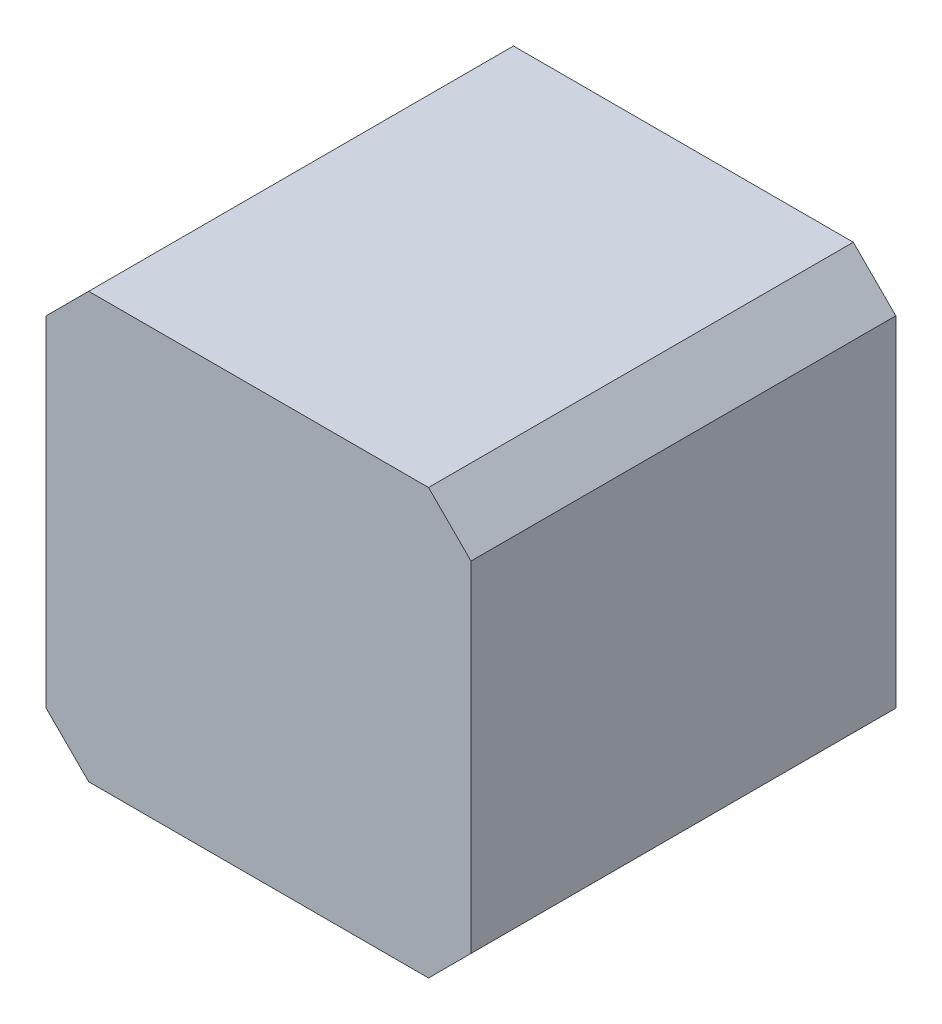
ISO-10303-21;
HEADER;
FILE_DESCRIPTION(('STEP AP214'),'2;1');
FILE_NAME('part.step','',(''),(''),'','','');
FILE_SCHEMA(('AUTOMOTIVE_DESIGN { 1 0 10303 214 1 1 1 1 }'));
ENDSEC;
DATA;
#1=APPLICATION_CONTEXT('core data for automotive mechanical design processes');
#2=APPLICATION_PROTOCOL_DEFINITION('international standard','automotive_design',2000,#1);
#3=PRODUCT_CONTEXT('',#1,'mechanical');
#4=PRODUCT('Part','Part','',(#3));
#5=PRODUCT_RELATED_PRODUCT_CATEGORY('part','',(#4));
#6=PRODUCT_DEFINITION_FORMATION('','',#4);
#7=PRODUCT_DEFINITION_CONTEXT('part definition',#1,'design');
#8=PRODUCT_DEFINITION('design','',#6,#7);
#9=PRODUCT_DEFINITION_SHAPE('','',#8);
#10=(LENGTH_UNIT() NAMED_UNIT(*) SI_UNIT(.MILLI.,.METRE.));
#11=(NAMED_UNIT(*) PLANE_ANGLE_UNIT() SI_UNIT($,.RADIAN.));
#12=(NAMED_UNIT(*) SI_UNIT($,.STERADIAN.) SOLID_ANGLE_UNIT());
#13=UNCERTAINTY_MEASURE_WITH_UNIT(LENGTH_MEASURE(1.E-05),#10,'distance_accuracy_value','');
#14=(GEOMETRIC_REPRESENTATION_CONTEXT(3) GLOBAL_UNCERTAINTY_ASSIGNED_CONTEXT((#13)) GLOBAL_UNIT_ASSIGNED_CONTEXT((#10,
#11,#12)) REPRESENTATION_CONTEXT('',''));
#15=CARTESIAN_POINT('',(0.,0.,0.));
#16=DIRECTION('',(0.,0.,1.));
#17=DIRECTION('',(1.,0.,0.));
#18=AXIS2_PLACEMENT_3D('',#15,#16,#17);
#19=CARTESIAN_POINT('',(1.27,1.016,0.));
#20=DIRECTION('',(-0.707106781186548,-0.707106781186548,0.));
#21=DIRECTION('',(0.707106781186548,-0.707106781186548,0.));
#22=AXIS2_PLACEMENT_3D('',#19,#20,#21);
#23=PLANE('',#22);
#24=DIRECTION('',(0.,0.,-1.));
#25=VECTOR('',#24,1.);
#26=CARTESIAN_POINT('',(1.016,1.27,0.));
#27=LINE('',#26,#25);
#28=CARTESIAN_POINT('',(1.016,1.27,0.));
#29=VERTEX_POINT('',#28);
#30=CARTESIAN_POINT('',(1.016,1.27,2.54));
#31=VERTEX_POINT('',#30);
#32=EDGE_CURVE('E79',#29,#31,#27,.F.);
#33=ORIENTED_EDGE('',*,*,#32,.T.);
#34=DIRECTION('',(0.707106781186547,-0.707106781186548,0.));
#35=VECTOR('',#34,1.);
#36=CARTESIAN_POINT('',(1.016,1.27,2.54));
#37=LINE('',#36,#35);
#38=CARTESIAN_POINT('',(1.27,1.016,2.54));
#39=VERTEX_POINT('',#38);
#40=EDGE_CURVE('E82',#31,#39,#37,.T.);
#41=ORIENTED_EDGE('',*,*,#40,.T.);
#42=DIRECTION('',(0.,0.,1.));
#43=VECTOR('',#42,1.);
#44=CARTESIAN_POINT('',(1.27,1.016,0.));
#45=LINE('',#44,#43);
#46=CARTESIAN_POINT('',(1.27,1.016,0.));
#47=VERTEX_POINT('',#46);
#48=EDGE_CURVE('E121',#39,#47,#45,.F.);
#49=ORIENTED_EDGE('',*,*,#48,.T.);
#50=DIRECTION('',(0.707106781186548,-0.707106781186548,0.));
#51=VECTOR('',#50,1.);
#52=CARTESIAN_POINT('',(1.27,1.016,0.));
#53=LINE('',#52,#51);
#54=EDGE_CURVE('E18',#29,#47,#53,.T.);
#55=ORIENTED_EDGE('',*,*,#54,.F.);
#56=EDGE_LOOP('',(#33,#41,#49,#55));
#57=FACE_BOUND('',#56,.T.);
#58=ADVANCED_FACE('F15',(#57),#23,.F.);
#59=CARTESIAN_POINT('',(1.016,-1.27,0.));
#60=DIRECTION('',(-0.707106781186548,0.707106781186548,0.));
#61=DIRECTION('',(-0.707106781186548,-0.707106781186548,0.));
#62=AXIS2_PLACEMENT_3D('',#59,#60,#61);
#63=PLANE('',#62);
#64=DIRECTION('',(0.,0.,1.));
#65=VECTOR('',#64,1.);
#66=CARTESIAN_POINT('',(1.27,-1.016,0.));
#67=LINE('',#66,#65);
#68=CARTESIAN_POINT('',(1.27,-1.016,0.));
#69=VERTEX_POINT('',#68);
#70=CARTESIAN_POINT('',(1.27,-1.016,2.54));
#71=VERTEX_POINT('',#70);
#72=EDGE_CURVE('E103',#69,#71,#67,.T.);
#73=ORIENTED_EDGE('',*,*,#72,.T.);
#74=DIRECTION('',(-0.707106781186547,-0.707106781186548,0.));
#75=VECTOR('',#74,1.);
#76=CARTESIAN_POINT('',(1.27,-1.016,2.54));
#77=LINE('',#76,#75);
#78=CARTESIAN_POINT('',(1.016,-1.27,2.54));
#79=VERTEX_POINT('',#78);
#80=EDGE_CURVE('E98',#71,#79,#77,.T.);
#81=ORIENTED_EDGE('',*,*,#80,.T.);
#82=DIRECTION('',(0.,0.,1.));
#83=VECTOR('',#82,1.);
#84=CARTESIAN_POINT('',(1.016,-1.27,0.));
#85=LINE('',#84,#83);
#86=CARTESIAN_POINT('',(1.016,-1.27,0.));
#87=VERTEX_POINT('',#86);
#88=EDGE_CURVE('E138',#79,#87,#85,.F.);
#89=ORIENTED_EDGE('',*,*,#88,.T.);
#90=DIRECTION('',(-0.707106781186548,-0.707106781186548,0.));
#91=VECTOR('',#90,1.);
#92=CARTESIAN_POINT('',(1.016,-1.27,0.));
#93=LINE('',#92,#91);
#94=EDGE_CURVE('E112',#69,#87,#93,.T.);
#95=ORIENTED_EDGE('',*,*,#94,.F.);
#96=EDGE_LOOP('',(#73,#81,#89,#95));
#97=FACE_BOUND('',#96,.T.);
#98=ADVANCED_FACE('F146',(#97),#63,.F.);
#99=CARTESIAN_POINT('',(-1.016,1.27,0.));
#100=DIRECTION('',(0.707106781186548,-0.707106781186548,0.));
#101=DIRECTION('',(0.707106781186548,0.707106781186548,0.));
#102=AXIS2_PLACEMENT_3D('',#99,#100,#101);
#103=PLANE('',#102);
#104=DIRECTION('',(0.,0.,-1.));
#105=VECTOR('',#104,1.);
#106=CARTESIAN_POINT('',(-1.27,1.016,0.));
#107=LINE('',#106,#105);
#108=CARTESIAN_POINT('',(-1.27,1.016,0.));
#109=VERTEX_POINT('',#108);
#110=CARTESIAN_POINT('',(-1.27,1.016,2.54));
#111=VERTEX_POINT('',#110);
#112=EDGE_CURVE('E136',#109,#111,#107,.F.);
#113=ORIENTED_EDGE('',*,*,#112,.T.);
#114=DIRECTION('',(0.707106781186548,0.707106781186548,0.));
#115=VECTOR('',#114,1.);
#116=CARTESIAN_POINT('',(-1.27,1.016,2.54));
#117=LINE('',#116,#115);
#118=CARTESIAN_POINT('',(-1.016,1.27,2.54));
#119=VERTEX_POINT('',#118);
#120=EDGE_CURVE('E74',#111,#119,#117,.T.);
#121=ORIENTED_EDGE('',*,*,#120,.T.);
#122=DIRECTION('',(0.,0.,-1.));
#123=VECTOR('',#122,1.);
#124=CARTESIAN_POINT('',(-1.016,1.27,0.));
#125=LINE('',#124,#123);
#126=CARTESIAN_POINT('',(-1.016,1.27,0.));
#127=VERTEX_POINT('',#126);
#128=EDGE_CURVE('E101',#119,#127,#125,.T.);
#129=ORIENTED_EDGE('',*,*,#128,.T.);
#130=DIRECTION('',(0.707106781186548,0.707106781186548,0.));
#131=VECTOR('',#130,1.);
#132=CARTESIAN_POINT('',(-1.016,1.27,0.));
#133=LINE('',#132,#131);
#134=EDGE_CURVE('E33',#109,#127,#133,.T.);
#135=ORIENTED_EDGE('',*,*,#134,.F.);
#136=EDGE_LOOP('',(#113,#121,#129,#135));
#137=FACE_BOUND('',#136,.T.);
#138=ADVANCED_FACE('F161',(#137),#103,.F.);
#139=CARTESIAN_POINT('',(-1.016,1.27,2.54));
#140=DIRECTION('',(0.,0.,-1.));
#141=DIRECTION('',(-1.,0.,0.));
#142=AXIS2_PLACEMENT_3D('',#139,#140,#141);
#143=PLANE('',#142);
#144=DIRECTION('',(0.,1.,0.));
#145=VECTOR('',#144,1.);
#146=CARTESIAN_POINT('',(-1.27,1.016,2.54));
#147=LINE('',#146,#145);
#148=CARTESIAN_POINT('',(-1.27,-1.016,2.54));
#149=VERTEX_POINT('',#148);
#150=EDGE_CURVE('E134',#111,#149,#147,.F.);
#151=ORIENTED_EDGE('',*,*,#150,.T.);
#152=DIRECTION('',(-0.707106781186548,0.707106781186548,0.));
#153=VECTOR('',#152,1.);
#154=CARTESIAN_POINT('',(-1.27,-1.016,2.54));
#155=LINE('',#154,#153);
#156=CARTESIAN_POINT('',(-1.016,-1.27,2.54));
#157=VERTEX_POINT('',#156);
#158=EDGE_CURVE('E108',#149,#157,#155,.F.);
#159=ORIENTED_EDGE('',*,*,#158,.T.);
#160=DIRECTION('',(1.,0.,0.));
#161=VECTOR('',#160,1.);
#162=CARTESIAN_POINT('',(-1.016,-1.27,2.54));
#163=LINE('',#162,#161);
#164=EDGE_CURVE('E140',#157,#79,#163,.T.);
#165=ORIENTED_EDGE('',*,*,#164,.T.);
#166=ORIENTED_EDGE('',*,*,#80,.F.);
#167=DIRECTION('',(0.,1.,0.));
#168=VECTOR('',#167,1.);
#169=CARTESIAN_POINT('',(1.27,-1.016,2.54));
#170=LINE('',#169,#168);
#171=EDGE_CURVE('E96',#71,#39,#170,.T.);
#172=ORIENTED_EDGE('',*,*,#171,.T.);
#173=ORIENTED_EDGE('',*,*,#40,.F.);
#174=DIRECTION('',(1.,0.,0.));
#175=VECTOR('',#174,1.);
#176=CARTESIAN_POINT('',(1.016,1.27,2.54));
#177=LINE('',#176,#175);
#178=EDGE_CURVE('E88',#31,#119,#177,.F.);
#179=ORIENTED_EDGE('',*,*,#178,.T.);
#180=ORIENTED_EDGE('',*,*,#120,.F.);
#181=EDGE_LOOP('',(#151,#159,#165,#166,#172,#173,#179,#180));
#182=FACE_BOUND('',#181,.T.);
#183=ADVANCED_FACE('F92',(#182),#143,.F.);
#184=CARTESIAN_POINT('',(-1.27,-1.016,0.));
#185=DIRECTION('',(0.707106781186548,0.707106781186548,0.));
#186=DIRECTION('',(-0.707106781186548,0.707106781186548,0.));
#187=AXIS2_PLACEMENT_3D('',#184,#185,#186);
#188=PLANE('',#187);
#189=DIRECTION('',(0.,0.,1.));
#190=VECTOR('',#189,1.);
#191=CARTESIAN_POINT('',(-1.016,-1.27,0.));
#192=LINE('',#191,#190);
#193=CARTESIAN_POINT('',(-1.016,-1.27,0.));
#194=VERTEX_POINT('',#193);
#195=EDGE_CURVE('E123',#194,#157,#192,.T.);
#196=ORIENTED_EDGE('',*,*,#195,.T.);
#197=ORIENTED_EDGE('',*,*,#158,.F.);
#198=DIRECTION('',(0.,0.,-1.));
#199=VECTOR('',#198,1.);
#200=CARTESIAN_POINT('',(-1.27,-1.016,0.));
#201=LINE('',#200,#199);
#202=CARTESIAN_POINT('',(-1.27,-1.016,0.));
#203=VERTEX_POINT('',#202);
#204=EDGE_CURVE('E129',#149,#203,#201,.T.);
#205=ORIENTED_EDGE('',*,*,#204,.T.);
#206=DIRECTION('',(-0.707106781186548,0.707106781186548,0.));
#207=VECTOR('',#206,1.);
#208=CARTESIAN_POINT('',(-1.27,-1.016,0.));
#209=LINE('',#208,#207);
#210=EDGE_CURVE('E89',#194,#203,#209,.T.);
#211=ORIENTED_EDGE('',*,*,#210,.F.);
#212=EDGE_LOOP('',(#196,#197,#205,#211));
#213=FACE_BOUND('',#212,.T.);
#214=ADVANCED_FACE('F157',(#213),#188,.F.);
#215=CARTESIAN_POINT('',(1.016,1.27,0.));
#216=DIRECTION('',(0.,-1.,0.));
#217=DIRECTION('',(0.,0.,-1.));
#218=AXIS2_PLACEMENT_3D('',#215,#216,#217);
#219=PLANE('',#218);
#220=ORIENTED_EDGE('',*,*,#128,.F.);
#221=ORIENTED_EDGE('',*,*,#178,.F.);
#222=ORIENTED_EDGE('',*,*,#32,.F.);
#223=DIRECTION('',(-1.,0.,0.));
#224=VECTOR('',#223,1.);
#225=CARTESIAN_POINT('',(-1.016,1.27,0.));
#226=LINE('',#225,#224);
#227=EDGE_CURVE('E120',#127,#29,#226,.F.);
#228=ORIENTED_EDGE('',*,*,#227,.F.);
#229=EDGE_LOOP('',(#220,#221,#222,#228));
#230=FACE_BOUND('',#229,.T.);
#231=ADVANCED_FACE('F100',(#230),#219,.F.);
#232=CARTESIAN_POINT('',(1.27,-1.016,0.));
#233=DIRECTION('',(-1.,0.,0.));
#234=DIRECTION('',(0.,0.,1.));
#235=AXIS2_PLACEMENT_3D('',#232,#233,#234);
#236=PLANE('',#235);
#237=ORIENTED_EDGE('',*,*,#48,.F.);
#238=ORIENTED_EDGE('',*,*,#171,.F.);
#239=ORIENTED_EDGE('',*,*,#72,.F.);
#240=DIRECTION('',(0.,1.,0.));
#241=VECTOR('',#240,1.);
#242=CARTESIAN_POINT('',(1.27,1.27,0.));
#243=LINE('',#242,#241);
#244=EDGE_CURVE('E119',#47,#69,#243,.F.);
#245=ORIENTED_EDGE('',*,*,#244,.F.);
#246=EDGE_LOOP('',(#237,#238,#239,#245));
#247=FACE_BOUND('',#246,.T.);
#248=ADVANCED_FACE('F126',(#247),#236,.F.);
#249=CARTESIAN_POINT('',(-1.016,-1.27,0.));
#250=DIRECTION('',(0.,1.,0.));
#251=DIRECTION('',(0.,0.,1.));
#252=AXIS2_PLACEMENT_3D('',#249,#250,#251);
#253=PLANE('',#252);
#254=ORIENTED_EDGE('',*,*,#88,.F.);
#255=ORIENTED_EDGE('',*,*,#164,.F.);
#256=ORIENTED_EDGE('',*,*,#195,.F.);
#257=DIRECTION('',(-1.,0.,0.));
#258=VECTOR('',#257,1.);
#259=CARTESIAN_POINT('',(-1.016,-1.27,0.));
#260=LINE('',#259,#258);
#261=EDGE_CURVE('E24',#87,#194,#260,.T.);
#262=ORIENTED_EDGE('',*,*,#261,.F.);
#263=EDGE_LOOP('',(#254,#255,#256,#262));
#264=FACE_BOUND('',#263,.T.);
#265=ADVANCED_FACE('F153',(#264),#253,.F.);
#266=CARTESIAN_POINT('',(-1.27,1.016,0.));
#267=DIRECTION('',(1.,0.,0.));
#268=DIRECTION('',(0.,0.,-1.));
#269=AXIS2_PLACEMENT_3D('',#266,#267,#268);
#270=PLANE('',#269);
#271=ORIENTED_EDGE('',*,*,#204,.F.);
#272=ORIENTED_EDGE('',*,*,#150,.F.);
#273=ORIENTED_EDGE('',*,*,#112,.F.);
#274=DIRECTION('',(0.,1.,0.));
#275=VECTOR('',#274,1.);
#276=CARTESIAN_POINT('',(-1.27,1.27,0.));
#277=LINE('',#276,#275);
#278=EDGE_CURVE('E10',#203,#109,#277,.T.);
#279=ORIENTED_EDGE('',*,*,#278,.F.);
#280=EDGE_LOOP('',(#271,#272,#273,#279));
#281=FACE_BOUND('',#280,.T.);
#282=ADVANCED_FACE('F160',(#281),#270,.F.);
#283=CARTESIAN_POINT('',(-1.016,1.27,0.));
#284=DIRECTION('',(0.,0.,-1.));
#285=DIRECTION('',(-1.,0.,0.));
#286=AXIS2_PLACEMENT_3D('',#283,#284,#285);
#287=PLANE('',#286);
#288=ORIENTED_EDGE('',*,*,#278,.T.);
#289=ORIENTED_EDGE('',*,*,#134,.T.);
#290=ORIENTED_EDGE('',*,*,#227,.T.);
#291=ORIENTED_EDGE('',*,*,#54,.T.);
#292=ORIENTED_EDGE('',*,*,#244,.T.);
#293=ORIENTED_EDGE('',*,*,#94,.T.);
#294=ORIENTED_EDGE('',*,*,#261,.T.);
#295=ORIENTED_EDGE('',*,*,#210,.T.);
#296=EDGE_LOOP('',(#288,#289,#290,#291,#292,#293,#294,#295));
#297=FACE_BOUND('',#296,.T.);
#298=ADVANCED_FACE('F117',(#297),#287,.T.);
#299=CLOSED_SHELL('',(#58,#98,#138,#183,#214,#231,#248,#265,#282,#298));
#300=MANIFOLD_SOLID_BREP('B1',#299);
#301=ADVANCED_BREP_SHAPE_REPRESENTATION('',(#18,#300),#14);
#302=SHAPE_DEFINITION_REPRESENTATION(#9,#301);
ENDSEC;
END-ISO-10303-21;
